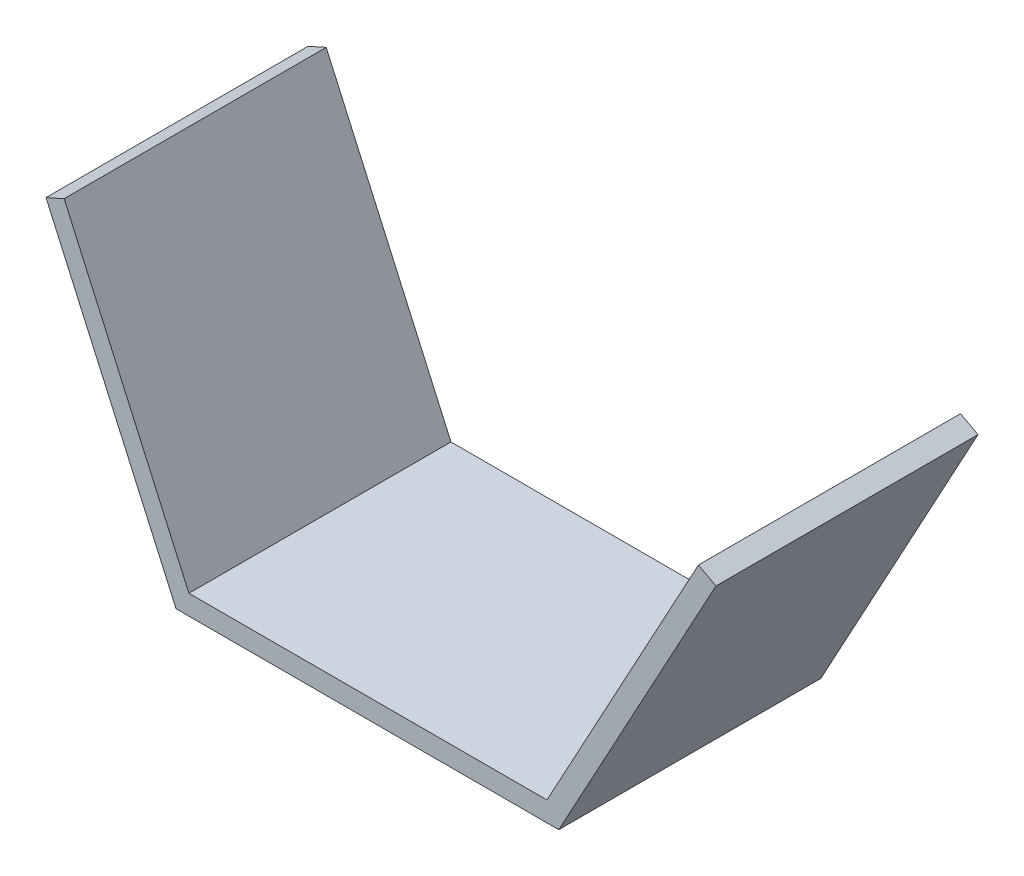
ISO-10303-21;
HEADER;
FILE_DESCRIPTION(('STEP AP214'),'2;1');
FILE_NAME('part.step','',(''),(''),'','','');
FILE_SCHEMA(('AUTOMOTIVE_DESIGN { 1 0 10303 214 1 1 1 1 }'));
ENDSEC;
DATA;
#1=APPLICATION_CONTEXT('core data for automotive mechanical design processes');
#2=APPLICATION_PROTOCOL_DEFINITION('international standard','automotive_design',2000,#1);
#3=PRODUCT_CONTEXT('',#1,'mechanical');
#4=PRODUCT('Part','Part','',(#3));
#5=PRODUCT_RELATED_PRODUCT_CATEGORY('part','',(#4));
#6=PRODUCT_DEFINITION_FORMATION('','',#4);
#7=PRODUCT_DEFINITION_CONTEXT('part definition',#1,'design');
#8=PRODUCT_DEFINITION('design','',#6,#7);
#9=PRODUCT_DEFINITION_SHAPE('','',#8);
#10=(LENGTH_UNIT() NAMED_UNIT(*) SI_UNIT(.MILLI.,.METRE.));
#11=(NAMED_UNIT(*) PLANE_ANGLE_UNIT() SI_UNIT($,.RADIAN.));
#12=(NAMED_UNIT(*) SI_UNIT($,.STERADIAN.) SOLID_ANGLE_UNIT());
#13=UNCERTAINTY_MEASURE_WITH_UNIT(LENGTH_MEASURE(1.E-05),#10,'distance_accuracy_value','');
#14=(GEOMETRIC_REPRESENTATION_CONTEXT(3) GLOBAL_UNCERTAINTY_ASSIGNED_CONTEXT((#13)) GLOBAL_UNIT_ASSIGNED_CONTEXT((#10,
#11,#12)) REPRESENTATION_CONTEXT('',''));
#15=CARTESIAN_POINT('',(0.,0.,0.));
#16=DIRECTION('',(0.,0.,1.));
#17=DIRECTION('',(1.,0.,0.));
#18=AXIS2_PLACEMENT_3D('',#15,#16,#17);
#19=CARTESIAN_POINT('',(67.4998341808884,-49.3436129304265,66.));
#20=DIRECTION('',(-0.878965427127945,0.476885497697077,0.));
#21=DIRECTION('',(-0.476885497697077,-0.878965427127946,0.));
#22=AXIS2_PLACEMENT_3D('',#19,#20,#21);
#23=PLANE('',#22);
#24=DIRECTION('',(0.476885497697077,0.878965427127945,0.));
#25=VECTOR('',#24,1.);
#26=CARTESIAN_POINT('',(67.4998341808884,-49.3436129304265,0.));
#27=LINE('',#26,#25);
#28=CARTESIAN_POINT('',(66.0807469671943,-51.9591854419411,0.));
#29=VERTEX_POINT('',#28);
#30=CARTESIAN_POINT('',(105.665865376729,21.0016210383777,0.));
#31=VERTEX_POINT('',#30);
#32=EDGE_CURVE('E142',#29,#31,#27,.T.);
#33=ORIENTED_EDGE('',*,*,#32,.T.);
#34=DIRECTION('',(0.,0.,-1.));
#35=VECTOR('',#34,1.);
#36=CARTESIAN_POINT('',(105.665865376729,21.0016210383777,66.));
#37=LINE('',#36,#35);
#38=CARTESIAN_POINT('',(105.665865376729,21.0016210383777,66.));
#39=VERTEX_POINT('',#38);
#40=EDGE_CURVE('E11',#39,#31,#37,.T.);
#41=ORIENTED_EDGE('',*,*,#40,.F.);
#42=DIRECTION('',(0.476885497697077,0.878965427127945,0.));
#43=VECTOR('',#42,1.);
#44=CARTESIAN_POINT('',(67.4998341808884,-49.3436129304265,66.));
#45=LINE('',#44,#43);
#46=CARTESIAN_POINT('',(66.0807469671943,-51.9591854419411,66.));
#47=VERTEX_POINT('',#46);
#48=EDGE_CURVE('E95',#47,#39,#45,.T.);
#49=ORIENTED_EDGE('',*,*,#48,.F.);
#50=DIRECTION('',(0.,0.,-1.));
#51=VECTOR('',#50,1.);
#52=CARTESIAN_POINT('',(66.0807469671943,-51.9591854419411,66.));
#53=LINE('',#52,#51);
#54=EDGE_CURVE('E141',#47,#29,#53,.T.);
#55=ORIENTED_EDGE('',*,*,#54,.T.);
#56=EDGE_LOOP('',(#33,#41,#49,#55));
#57=FACE_BOUND('',#56,.T.);
#58=ADVANCED_FACE('F39',(#57),#23,.F.);
#59=CARTESIAN_POINT('',(101.271038241089,23.3860485268631,66.));
#60=DIRECTION('',(0.476885497697077,0.878965427127945,0.));
#61=DIRECTION('',(-0.878965427127945,0.476885497697077,0.));
#62=AXIS2_PLACEMENT_3D('',#59,#60,#61);
#63=PLANE('',#62);
#64=DIRECTION('',(0.878965427127945,-0.476885497697077,0.));
#65=VECTOR('',#64,1.);
#66=CARTESIAN_POINT('',(101.271038241089,23.3860485268631,0.));
#67=LINE('',#66,#65);
#68=CARTESIAN_POINT('',(101.271038241089,23.3860485268631,0.));
#69=VERTEX_POINT('',#68);
#70=EDGE_CURVE('E146',#69,#31,#67,.T.);
#71=ORIENTED_EDGE('',*,*,#70,.F.);
#72=DIRECTION('',(0.,0.,-1.));
#73=VECTOR('',#72,1.);
#74=CARTESIAN_POINT('',(101.271038241089,23.3860485268631,66.));
#75=LINE('',#74,#73);
#76=CARTESIAN_POINT('',(101.271038241089,23.3860485268631,66.));
#77=VERTEX_POINT('',#76);
#78=EDGE_CURVE('E48',#77,#69,#75,.T.);
#79=ORIENTED_EDGE('',*,*,#78,.F.);
#80=DIRECTION('',(0.878965427127945,-0.476885497697077,0.));
#81=VECTOR('',#80,1.);
#82=CARTESIAN_POINT('',(101.271038241089,23.3860485268631,66.));
#83=LINE('',#82,#81);
#84=EDGE_CURVE('E198',#77,#39,#83,.T.);
#85=ORIENTED_EDGE('',*,*,#84,.T.);
#86=ORIENTED_EDGE('',*,*,#40,.T.);
#87=EDGE_LOOP('',(#71,#79,#85,#86));
#88=FACE_BOUND('',#87,.T.);
#89=ADVANCED_FACE('F189',(#88),#63,.T.);
#90=CARTESIAN_POINT('',(63.1050070452487,-46.9591854419411,66.));
#91=DIRECTION('',(-0.878965427127945,0.476885497697077,0.));
#92=DIRECTION('',(-0.476885497697077,-0.878965427127946,0.));
#93=AXIS2_PLACEMENT_3D('',#90,#91,#92);
#94=PLANE('',#93);
#95=DIRECTION('',(0.476885497697077,0.878965427127945,0.));
#96=VECTOR('',#95,1.);
#97=CARTESIAN_POINT('',(63.1050070452487,-46.9591854419411,0.));
#98=LINE('',#97,#96);
#99=CARTESIAN_POINT('',(63.1050070452487,-46.9591854419411,0.));
#100=VERTEX_POINT('',#99);
#101=EDGE_CURVE('E150',#100,#69,#98,.T.);
#102=ORIENTED_EDGE('',*,*,#101,.F.);
#103=DIRECTION('',(0.,0.,-1.));
#104=VECTOR('',#103,1.);
#105=CARTESIAN_POINT('',(63.1050070452487,-46.9591854419411,66.));
#106=LINE('',#105,#104);
#107=CARTESIAN_POINT('',(63.1050070452487,-46.9591854419411,66.));
#108=VERTEX_POINT('',#107);
#109=EDGE_CURVE('E177',#108,#100,#106,.T.);
#110=ORIENTED_EDGE('',*,*,#109,.F.);
#111=DIRECTION('',(0.476885497697077,0.878965427127945,0.));
#112=VECTOR('',#111,1.);
#113=CARTESIAN_POINT('',(63.1050070452487,-46.9591854419411,66.));
#114=LINE('',#113,#112);
#115=EDGE_CURVE('E186',#108,#77,#114,.T.);
#116=ORIENTED_EDGE('',*,*,#115,.T.);
#117=ORIENTED_EDGE('',*,*,#78,.T.);
#118=EDGE_LOOP('',(#102,#110,#116,#117));
#119=FACE_BOUND('',#118,.T.);
#120=ADVANCED_FACE('F184',(#119),#94,.T.);
#121=CARTESIAN_POINT('',(-27.0715960743353,-46.9591854419411,66.));
#122=DIRECTION('',(0.,1.,0.));
#123=DIRECTION('',(0.,0.,1.));
#124=AXIS2_PLACEMENT_3D('',#121,#122,#123);
#125=PLANE('',#124);
#126=DIRECTION('',(1.,0.,0.));
#127=VECTOR('',#126,1.);
#128=CARTESIAN_POINT('',(-27.0715960743353,-46.9591854419411,0.));
#129=LINE('',#128,#127);
#130=CARTESIAN_POINT('',(-27.0715960743353,-46.9591854419411,0.));
#131=VERTEX_POINT('',#130);
#132=EDGE_CURVE('E154',#131,#100,#129,.T.);
#133=ORIENTED_EDGE('',*,*,#132,.F.);
#134=DIRECTION('',(0.,0.,-1.));
#135=VECTOR('',#134,1.);
#136=CARTESIAN_POINT('',(-27.0715960743353,-46.9591854419411,66.));
#137=LINE('',#136,#135);
#138=CARTESIAN_POINT('',(-27.0715960743353,-46.9591854419411,66.));
#139=VERTEX_POINT('',#138);
#140=EDGE_CURVE('E174',#139,#131,#137,.T.);
#141=ORIENTED_EDGE('',*,*,#140,.F.);
#142=DIRECTION('',(1.,0.,0.));
#143=VECTOR('',#142,1.);
#144=CARTESIAN_POINT('',(-27.0715960743353,-46.9591854419411,66.));
#145=LINE('',#144,#143);
#146=EDGE_CURVE('E135',#139,#108,#145,.T.);
#147=ORIENTED_EDGE('',*,*,#146,.T.);
#148=ORIENTED_EDGE('',*,*,#109,.T.);
#149=EDGE_LOOP('',(#133,#141,#147,#148));
#150=FACE_BOUND('',#149,.T.);
#151=ADVANCED_FACE('F196',(#150),#125,.T.);
#152=CARTESIAN_POINT('',(-58.5024452944393,23.3860485268631,66.));
#153=DIRECTION('',(0.913008710615828,0.407940062190051,0.));
#154=DIRECTION('',(-0.407940062190051,0.913008710615828,0.));
#155=AXIS2_PLACEMENT_3D('',#152,#153,#154);
#156=PLANE('',#155);
#157=DIRECTION('',(0.407940062190051,-0.913008710615828,0.));
#158=VECTOR('',#157,1.);
#159=CARTESIAN_POINT('',(-58.5024452944393,23.3860485268631,0.));
#160=LINE('',#159,#158);
#161=CARTESIAN_POINT('',(-58.5024452944393,23.3860485268631,0.));
#162=VERTEX_POINT('',#161);
#163=EDGE_CURVE('E158',#162,#131,#160,.T.);
#164=ORIENTED_EDGE('',*,*,#163,.F.);
#165=DIRECTION('',(0.,0.,-1.));
#166=VECTOR('',#165,1.);
#167=CARTESIAN_POINT('',(-58.5024452944393,23.3860485268631,66.));
#168=LINE('',#167,#166);
#169=CARTESIAN_POINT('',(-58.5024452944393,23.3860485268631,66.));
#170=VERTEX_POINT('',#169);
#171=EDGE_CURVE('E120',#170,#162,#168,.T.);
#172=ORIENTED_EDGE('',*,*,#171,.F.);
#173=DIRECTION('',(0.407940062190051,-0.913008710615828,0.));
#174=VECTOR('',#173,1.);
#175=CARTESIAN_POINT('',(-58.5024452944393,23.3860485268631,66.));
#176=LINE('',#175,#174);
#177=EDGE_CURVE('E131',#170,#139,#176,.T.);
#178=ORIENTED_EDGE('',*,*,#177,.T.);
#179=ORIENTED_EDGE('',*,*,#140,.T.);
#180=EDGE_LOOP('',(#164,#172,#178,#179));
#181=FACE_BOUND('',#180,.T.);
#182=ADVANCED_FACE('F207',(#181),#156,.T.);
#183=CARTESIAN_POINT('',(-63.0674888475185,21.3463482159128,66.));
#184=DIRECTION('',(-0.407940062190051,0.913008710615828,0.));
#185=DIRECTION('',(-0.913008710615828,-0.407940062190051,0.));
#186=AXIS2_PLACEMENT_3D('',#183,#184,#185);
#187=PLANE('',#186);
#188=DIRECTION('',(0.913008710615828,0.407940062190051,0.));
#189=VECTOR('',#188,1.);
#190=CARTESIAN_POINT('',(-63.0674888475185,21.3463482159128,0.));
#191=LINE('',#190,#189);
#192=CARTESIAN_POINT('',(-63.0674888475185,21.3463482159128,0.));
#193=VERTEX_POINT('',#192);
#194=EDGE_CURVE('E118',#193,#162,#191,.T.);
#195=ORIENTED_EDGE('',*,*,#194,.F.);
#196=DIRECTION('',(0.,0.,-1.));
#197=VECTOR('',#196,1.);
#198=CARTESIAN_POINT('',(-63.0674888475185,21.3463482159128,66.));
#199=LINE('',#198,#197);
#200=CARTESIAN_POINT('',(-63.0674888475185,21.3463482159128,66.));
#201=VERTEX_POINT('',#200);
#202=EDGE_CURVE('E112',#201,#193,#199,.T.);
#203=ORIENTED_EDGE('',*,*,#202,.F.);
#204=DIRECTION('',(0.913008710615828,0.407940062190051,0.));
#205=VECTOR('',#204,1.);
#206=CARTESIAN_POINT('',(-63.0674888475185,21.3463482159128,66.));
#207=LINE('',#206,#205);
#208=EDGE_CURVE('E116',#201,#170,#207,.T.);
#209=ORIENTED_EDGE('',*,*,#208,.T.);
#210=ORIENTED_EDGE('',*,*,#171,.T.);
#211=EDGE_LOOP('',(#195,#203,#209,#210));
#212=FACE_BOUND('',#211,.T.);
#213=ADVANCED_FACE('F114',(#212),#187,.T.);
#214=CARTESIAN_POINT('',(-63.0674888475185,21.3463482159128,66.));
#215=DIRECTION('',(0.913008710615828,0.407940062190051,0.));
#216=DIRECTION('',(-0.407940062190051,0.913008710615828,0.));
#217=AXIS2_PLACEMENT_3D('',#214,#215,#216);
#218=PLANE('',#217);
#219=DIRECTION('',(0.407940062190051,-0.913008710615828,0.));
#220=VECTOR('',#219,1.);
#221=CARTESIAN_POINT('',(-63.0674888475185,21.3463482159128,0.));
#222=LINE('',#221,#220);
#223=CARTESIAN_POINT('',(-30.3139525323072,-51.9591854419411,0.));
#224=VERTEX_POINT('',#223);
#225=EDGE_CURVE('E83',#193,#224,#222,.T.);
#226=ORIENTED_EDGE('',*,*,#225,.T.);
#227=DIRECTION('',(0.,0.,-1.));
#228=VECTOR('',#227,1.);
#229=CARTESIAN_POINT('',(-30.3139525323072,-51.9591854419411,66.));
#230=LINE('',#229,#228);
#231=CARTESIAN_POINT('',(-30.3139525323072,-51.9591854419411,66.));
#232=VERTEX_POINT('',#231);
#233=EDGE_CURVE('E121',#232,#224,#230,.T.);
#234=ORIENTED_EDGE('',*,*,#233,.F.);
#235=DIRECTION('',(0.407940062190051,-0.913008710615828,0.));
#236=VECTOR('',#235,1.);
#237=CARTESIAN_POINT('',(-63.0674888475185,21.3463482159128,66.));
#238=LINE('',#237,#236);
#239=EDGE_CURVE('E123',#201,#232,#238,.T.);
#240=ORIENTED_EDGE('',*,*,#239,.F.);
#241=ORIENTED_EDGE('',*,*,#202,.T.);
#242=EDGE_LOOP('',(#226,#234,#240,#241));
#243=FACE_BOUND('',#242,.T.);
#244=ADVANCED_FACE('F124',(#243),#218,.F.);
#245=CARTESIAN_POINT('',(-27.0715960743353,-51.9591854419411,66.));
#246=DIRECTION('',(0.,1.,0.));
#247=DIRECTION('',(0.,0.,1.));
#248=AXIS2_PLACEMENT_3D('',#245,#246,#247);
#249=PLANE('',#248);
#250=DIRECTION('',(1.,0.,0.));
#251=VECTOR('',#250,1.);
#252=CARTESIAN_POINT('',(-27.0715960743353,-51.9591854419411,0.));
#253=LINE('',#252,#251);
#254=EDGE_CURVE('E89',#224,#29,#253,.T.);
#255=ORIENTED_EDGE('',*,*,#254,.T.);
#256=ORIENTED_EDGE('',*,*,#54,.F.);
#257=DIRECTION('',(1.,0.,0.));
#258=VECTOR('',#257,1.);
#259=CARTESIAN_POINT('',(-27.0715960743353,-51.9591854419411,66.));
#260=LINE('',#259,#258);
#261=EDGE_CURVE('E56',#232,#47,#260,.T.);
#262=ORIENTED_EDGE('',*,*,#261,.F.);
#263=ORIENTED_EDGE('',*,*,#233,.T.);
#264=EDGE_LOOP('',(#255,#256,#262,#263));
#265=FACE_BOUND('',#264,.T.);
#266=ADVANCED_FACE('F209',(#265),#249,.F.);
#267=CARTESIAN_POINT('',(0.,0.,66.));
#268=DIRECTION('',(0.,0.,-1.));
#269=DIRECTION('',(-1.,0.,0.));
#270=AXIS2_PLACEMENT_3D('',#267,#268,#269);
#271=PLANE('',#270);
#272=ORIENTED_EDGE('',*,*,#48,.T.);
#273=ORIENTED_EDGE('',*,*,#84,.F.);
#274=ORIENTED_EDGE('',*,*,#115,.F.);
#275=ORIENTED_EDGE('',*,*,#146,.F.);
#276=ORIENTED_EDGE('',*,*,#177,.F.);
#277=ORIENTED_EDGE('',*,*,#208,.F.);
#278=ORIENTED_EDGE('',*,*,#239,.T.);
#279=ORIENTED_EDGE('',*,*,#261,.T.);
#280=EDGE_LOOP('',(#272,#273,#274,#275,#276,#277,#278,#279));
#281=FACE_BOUND('',#280,.T.);
#282=ADVANCED_FACE('F128',(#281),#271,.F.);
#283=CARTESIAN_POINT('',(0.,0.,0.));
#284=DIRECTION('',(0.,0.,-1.));
#285=DIRECTION('',(-1.,0.,0.));
#286=AXIS2_PLACEMENT_3D('',#283,#284,#285);
#287=PLANE('',#286);
#288=ORIENTED_EDGE('',*,*,#32,.F.);
#289=ORIENTED_EDGE('',*,*,#254,.F.);
#290=ORIENTED_EDGE('',*,*,#225,.F.);
#291=ORIENTED_EDGE('',*,*,#194,.T.);
#292=ORIENTED_EDGE('',*,*,#163,.T.);
#293=ORIENTED_EDGE('',*,*,#132,.T.);
#294=ORIENTED_EDGE('',*,*,#101,.T.);
#295=ORIENTED_EDGE('',*,*,#70,.T.);
#296=EDGE_LOOP('',(#288,#289,#290,#291,#292,#293,#294,#295));
#297=FACE_BOUND('',#296,.T.);
#298=ADVANCED_FACE('F192',(#297),#287,.T.);
#299=CLOSED_SHELL('',(#58,#89,#120,#151,#182,#213,#244,#266,#282,#298));
#300=MANIFOLD_SOLID_BREP('B2',#299);
#301=ADVANCED_BREP_SHAPE_REPRESENTATION('',(#18,#300),#14);
#302=SHAPE_DEFINITION_REPRESENTATION(#9,#301);
ENDSEC;
END-ISO-10303-21;
